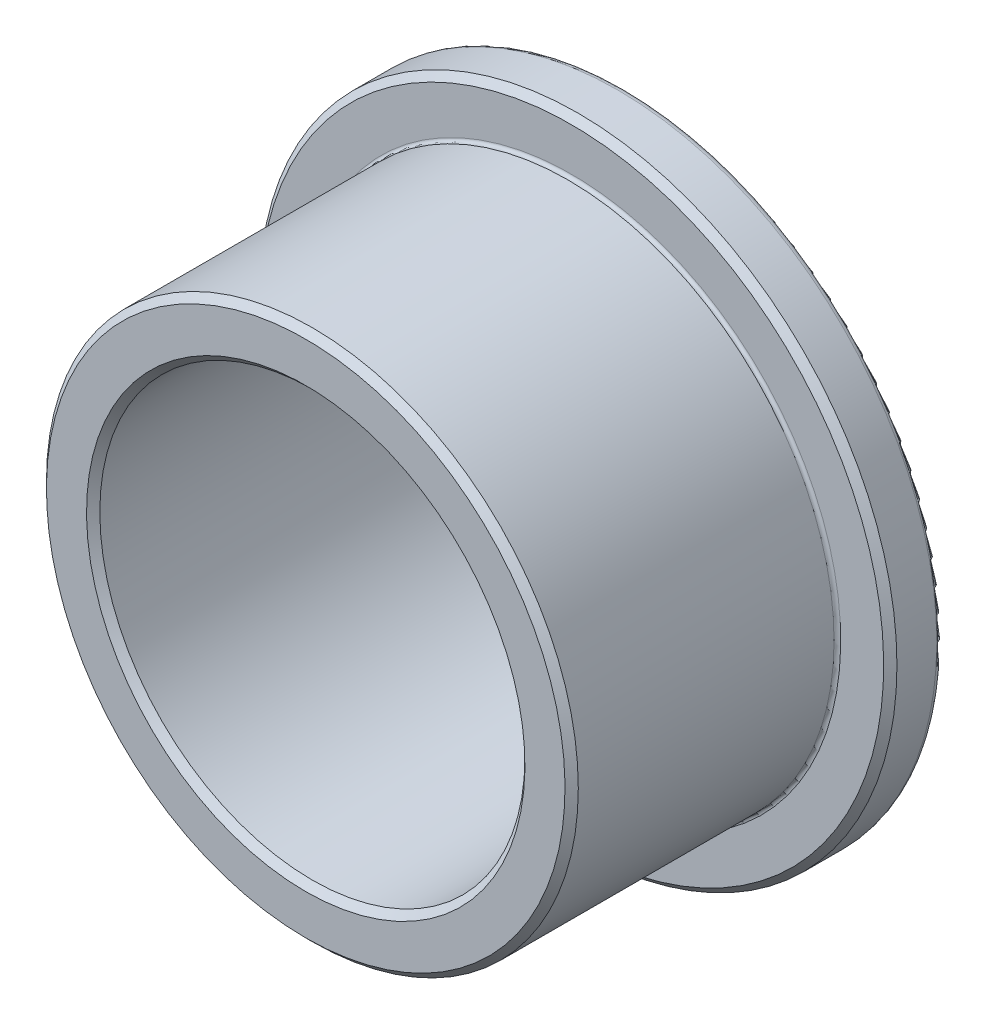
ISO-10303-21;
HEADER;
FILE_DESCRIPTION(('STEP AP214'),'2;1');
FILE_NAME('part.step','',(''),(''),'','','');
FILE_SCHEMA(('AUTOMOTIVE_DESIGN { 1 0 10303 214 1 1 1 1 }'));
ENDSEC;
DATA;
#1=APPLICATION_CONTEXT('core data for automotive mechanical design processes');
#2=APPLICATION_PROTOCOL_DEFINITION('international standard','automotive_design',2000,#1);
#3=PRODUCT_CONTEXT('',#1,'mechanical');
#4=PRODUCT('Part','Part','',(#3));
#5=PRODUCT_RELATED_PRODUCT_CATEGORY('part','',(#4));
#6=PRODUCT_DEFINITION_FORMATION('','',#4);
#7=PRODUCT_DEFINITION_CONTEXT('part definition',#1,'design');
#8=PRODUCT_DEFINITION('design','',#6,#7);
#9=PRODUCT_DEFINITION_SHAPE('','',#8);
#10=(LENGTH_UNIT() NAMED_UNIT(*) SI_UNIT(.MILLI.,.METRE.));
#11=(NAMED_UNIT(*) PLANE_ANGLE_UNIT() SI_UNIT($,.RADIAN.));
#12=(NAMED_UNIT(*) SI_UNIT($,.STERADIAN.) SOLID_ANGLE_UNIT());
#13=UNCERTAINTY_MEASURE_WITH_UNIT(LENGTH_MEASURE(1.E-05),#10,'distance_accuracy_value','');
#14=(GEOMETRIC_REPRESENTATION_CONTEXT(3) GLOBAL_UNCERTAINTY_ASSIGNED_CONTEXT((#13)) GLOBAL_UNIT_ASSIGNED_CONTEXT((#10,
#11,#12)) REPRESENTATION_CONTEXT('',''));
#15=CARTESIAN_POINT('',(0.,0.,0.));
#16=DIRECTION('',(0.,0.,1.));
#17=DIRECTION('',(1.,0.,0.));
#18=AXIS2_PLACEMENT_3D('',#15,#16,#17);
#19=CARTESIAN_POINT('',(0.,19.05,-9.525));
#20=DIRECTION('',(0.,0.,-1.));
#21=DIRECTION('',(0.,1.,0.));
#22=AXIS2_PLACEMENT_3D('',#19,#20,#21);
#23=PLANE('',#22);
#24=CARTESIAN_POINT('',(0.,0.,-9.525));
#25=DIRECTION('',(0.,0.,-1.));
#26=DIRECTION('',(0.,1.,0.));
#27=AXIS2_PLACEMENT_3D('',#24,#25,#26);
#28=CIRCLE('',#27,18.653125);
#29=CARTESIAN_POINT('',(0.,18.653125,-9.525));
#30=VERTEX_POINT('',#29);
#31=EDGE_CURVE('E59',#30,#30,#28,.T.);
#32=ORIENTED_EDGE('',*,*,#31,.T.);
#33=EDGE_LOOP('',(#32));
#34=FACE_BOUND('',#33,.T.);
#35=CARTESIAN_POINT('',(0.,0.,-9.525));
#36=DIRECTION('',(0.,0.,-1.));
#37=DIRECTION('',(0.,1.,0.));
#38=AXIS2_PLACEMENT_3D('',#35,#36,#37);
#39=CIRCLE('',#38,12.7);
#40=CARTESIAN_POINT('',(0.,12.7,-9.525));
#41=VERTEX_POINT('',#40);
#42=EDGE_CURVE('E89',#41,#41,#39,.T.);
#43=ORIENTED_EDGE('',*,*,#42,.F.);
#44=EDGE_LOOP('',(#43));
#45=FACE_BOUND('',#44,.T.);
#46=ADVANCED_FACE('F41',(#34,#45),#23,.T.);
#47=CARTESIAN_POINT('',(0.,0.,-9.525));
#48=DIRECTION('',(0.,0.,-1.));
#49=DIRECTION('',(0.,1.,0.));
#50=AXIS2_PLACEMENT_3D('',#47,#48,#49);
#51=CYLINDRICAL_SURFACE('',#50,19.05);
#52=CARTESIAN_POINT('',(0.,0.,-9.128125));
#53=DIRECTION('',(0.,0.,-1.));
#54=DIRECTION('',(0.,1.,0.));
#55=AXIS2_PLACEMENT_3D('',#52,#53,#54);
#56=CIRCLE('',#55,19.05);
#57=CARTESIAN_POINT('',(0.,19.05,-9.128125));
#58=VERTEX_POINT('',#57);
#59=EDGE_CURVE('E54',#58,#58,#56,.F.);
#60=ORIENTED_EDGE('',*,*,#59,.T.);
#61=EDGE_LOOP('',(#60));
#62=FACE_BOUND('',#61,.T.);
#63=CARTESIAN_POINT('',(0.,0.,-6.74687499999999));
#64=DIRECTION('',(0.,0.,1.));
#65=DIRECTION('',(0.,-1.,0.));
#66=AXIS2_PLACEMENT_3D('',#63,#64,#65);
#67=CIRCLE('',#66,19.05);
#68=CARTESIAN_POINT('',(0.,-19.05,-6.746875));
#69=VERTEX_POINT('',#68);
#70=EDGE_CURVE('E85',#69,#69,#67,.F.);
#71=ORIENTED_EDGE('',*,*,#70,.T.);
#72=EDGE_LOOP('',(#71));
#73=FACE_BOUND('',#72,.T.);
#74=ADVANCED_FACE('F97',(#62,#73),#51,.T.);
#75=CARTESIAN_POINT('',(0.,19.05,-6.35));
#76=DIRECTION('',(0.,0.,1.));
#77=DIRECTION('',(0.,-1.,0.));
#78=AXIS2_PLACEMENT_3D('',#75,#76,#77);
#79=PLANE('',#78);
#80=CARTESIAN_POINT('',(0.,0.,-6.35));
#81=DIRECTION('',(0.,0.,1.));
#82=DIRECTION('',(0.,-1.,0.));
#83=AXIS2_PLACEMENT_3D('',#80,#81,#82);
#84=CIRCLE('',#83,16.0861375);
#85=CARTESIAN_POINT('',(0.,-16.0861375,-6.35));
#86=VERTEX_POINT('',#85);
#87=EDGE_CURVE('E49',#86,#86,#84,.F.);
#88=ORIENTED_EDGE('',*,*,#87,.T.);
#89=EDGE_LOOP('',(#88));
#90=FACE_BOUND('',#89,.T.);
#91=CARTESIAN_POINT('',(0.,0.,-6.35));
#92=DIRECTION('',(0.,0.,1.));
#93=DIRECTION('',(0.,-1.,0.));
#94=AXIS2_PLACEMENT_3D('',#91,#92,#93);
#95=CIRCLE('',#94,18.653125);
#96=CARTESIAN_POINT('',(0.,-18.653125,-6.35));
#97=VERTEX_POINT('',#96);
#98=EDGE_CURVE('E81',#97,#97,#95,.T.);
#99=ORIENTED_EDGE('',*,*,#98,.T.);
#100=EDGE_LOOP('',(#99));
#101=FACE_BOUND('',#100,.T.);
#102=ADVANCED_FACE('F104',(#90,#101),#79,.T.);
#103=CARTESIAN_POINT('',(0.,0.,-9.525));
#104=DIRECTION('',(0.,0.,-1.));
#105=DIRECTION('',(0.,1.,0.));
#106=AXIS2_PLACEMENT_3D('',#103,#104,#105);
#107=CYLINDRICAL_SURFACE('',#106,15.8877);
#108=CARTESIAN_POINT('',(0.,0.,-6.1515625));
#109=DIRECTION('',(0.,0.,1.));
#110=DIRECTION('',(0.,-1.,0.));
#111=AXIS2_PLACEMENT_3D('',#108,#109,#110);
#112=CIRCLE('',#111,15.8877);
#113=CARTESIAN_POINT('',(0.,-15.8877,-6.1515625));
#114=VERTEX_POINT('',#113);
#115=EDGE_CURVE('E10',#114,#114,#112,.T.);
#116=ORIENTED_EDGE('',*,*,#115,.T.);
#117=EDGE_LOOP('',(#116));
#118=FACE_BOUND('',#117,.T.);
#119=CARTESIAN_POINT('',(0.,0.,9.128125));
#120=DIRECTION('',(0.,0.,1.));
#121=DIRECTION('',(0.,-1.,0.));
#122=AXIS2_PLACEMENT_3D('',#119,#120,#121);
#123=CIRCLE('',#122,15.8877);
#124=CARTESIAN_POINT('',(0.,-15.8877,9.128125));
#125=VERTEX_POINT('',#124);
#126=EDGE_CURVE('E77',#125,#125,#123,.F.);
#127=ORIENTED_EDGE('',*,*,#126,.T.);
#128=EDGE_LOOP('',(#127));
#129=FACE_BOUND('',#128,.T.);
#130=ADVANCED_FACE('F139',(#118,#129),#107,.T.);
#131=CARTESIAN_POINT('',(0.,15.8877,9.525));
#132=DIRECTION('',(0.,0.,1.));
#133=DIRECTION('',(0.,-1.,0.));
#134=AXIS2_PLACEMENT_3D('',#131,#132,#133);
#135=PLANE('',#134);
#136=CARTESIAN_POINT('',(0.,0.,9.525));
#137=DIRECTION('',(0.,0.,1.));
#138=DIRECTION('',(0.,-1.,0.));
#139=AXIS2_PLACEMENT_3D('',#136,#137,#138);
#140=CIRCLE('',#139,15.490825);
#141=CARTESIAN_POINT('',(0.,-15.490825,9.525));
#142=VERTEX_POINT('',#141);
#143=EDGE_CURVE('E69',#142,#142,#140,.T.);
#144=ORIENTED_EDGE('',*,*,#143,.T.);
#145=EDGE_LOOP('',(#144));
#146=FACE_BOUND('',#145,.T.);
#147=CARTESIAN_POINT('',(0.,0.,9.525));
#148=DIRECTION('',(0.,0.,1.));
#149=DIRECTION('',(0.,-1.,0.));
#150=AXIS2_PLACEMENT_3D('',#147,#148,#149);
#151=CIRCLE('',#150,13.096875);
#152=CARTESIAN_POINT('',(0.,-13.096875,9.525));
#153=VERTEX_POINT('',#152);
#154=EDGE_CURVE('E73',#153,#153,#151,.F.);
#155=ORIENTED_EDGE('',*,*,#154,.T.);
#156=EDGE_LOOP('',(#155));
#157=FACE_BOUND('',#156,.T.);
#158=ADVANCED_FACE('F142',(#146,#157),#135,.T.);
#159=CARTESIAN_POINT('',(0.,0.,-9.525));
#160=DIRECTION('',(0.,0.,-1.));
#161=DIRECTION('',(0.,1.,0.));
#162=AXIS2_PLACEMENT_3D('',#159,#160,#161);
#163=CYLINDRICAL_SURFACE('',#162,12.7);
#164=CARTESIAN_POINT('',(0.,0.,9.128125));
#165=DIRECTION('',(0.,0.,1.));
#166=DIRECTION('',(0.,-1.,0.));
#167=AXIS2_PLACEMENT_3D('',#164,#165,#166);
#168=CIRCLE('',#167,12.7);
#169=CARTESIAN_POINT('',(0.,-12.7,9.128125));
#170=VERTEX_POINT('',#169);
#171=EDGE_CURVE('E65',#170,#170,#168,.T.);
#172=ORIENTED_EDGE('',*,*,#171,.T.);
#173=EDGE_LOOP('',(#172));
#174=FACE_BOUND('',#173,.T.);
#175=ORIENTED_EDGE('',*,*,#42,.T.);
#176=EDGE_LOOP('',(#175));
#177=FACE_BOUND('',#176,.T.);
#178=ADVANCED_FACE('F94',(#174,#177),#163,.F.);
#179=CARTESIAN_POINT('',(0.,0.,-6.74687499999999));
#180=DIRECTION('',(0.,0.,-1.));
#181=DIRECTION('',(0.,1.,0.));
#182=AXIS2_PLACEMENT_3D('',#179,#180,#181);
#183=CONICAL_SURFACE('',#182,19.05,0.785398163397448);
#184=ORIENTED_EDGE('',*,*,#98,.F.);
#185=EDGE_LOOP('',(#184));
#186=FACE_BOUND('',#185,.T.);
#187=ORIENTED_EDGE('',*,*,#70,.F.);
#188=EDGE_LOOP('',(#187));
#189=FACE_BOUND('',#188,.T.);
#190=ADVANCED_FACE('F109',(#186,#189),#183,.T.);
#191=CARTESIAN_POINT('',(0.,0.,9.128125));
#192=DIRECTION('',(0.,0.,-1.));
#193=DIRECTION('',(0.,1.,0.));
#194=AXIS2_PLACEMENT_3D('',#191,#192,#193);
#195=CONICAL_SURFACE('',#194,15.8877,0.785398163397448);
#196=ORIENTED_EDGE('',*,*,#143,.F.);
#197=EDGE_LOOP('',(#196));
#198=FACE_BOUND('',#197,.T.);
#199=ORIENTED_EDGE('',*,*,#126,.F.);
#200=EDGE_LOOP('',(#199));
#201=FACE_BOUND('',#200,.T.);
#202=ADVANCED_FACE('F112',(#198,#201),#195,.T.);
#203=CARTESIAN_POINT('',(0.,0.,9.525));
#204=DIRECTION('',(0.,0.,1.));
#205=DIRECTION('',(0.,-1.,0.));
#206=AXIS2_PLACEMENT_3D('',#203,#204,#205);
#207=CONICAL_SURFACE('',#206,13.096875,0.78539816339745);
#208=ORIENTED_EDGE('',*,*,#171,.F.);
#209=EDGE_LOOP('',(#208));
#210=FACE_BOUND('',#209,.T.);
#211=ORIENTED_EDGE('',*,*,#154,.F.);
#212=EDGE_LOOP('',(#211));
#213=FACE_BOUND('',#212,.T.);
#214=ADVANCED_FACE('F116',(#210,#213),#207,.F.);
#215=CARTESIAN_POINT('',(0.,0.,-9.128125));
#216=DIRECTION('',(0.,0.,-1.));
#217=DIRECTION('',(0.,1.,0.));
#218=AXIS2_PLACEMENT_3D('',#215,#216,#217);
#219=TOROIDAL_SURFACE('',#218,18.653125,0.396875);
#220=ORIENTED_EDGE('',*,*,#59,.F.);
#221=EDGE_LOOP('',(#220));
#222=FACE_BOUND('',#221,.T.);
#223=ORIENTED_EDGE('',*,*,#31,.F.);
#224=EDGE_LOOP('',(#223));
#225=FACE_BOUND('',#224,.T.);
#226=ADVANCED_FACE('F118',(#222,#225),#219,.T.);
#227=CARTESIAN_POINT('',(0.,0.,-6.1515625));
#228=DIRECTION('',(0.,0.,1.));
#229=DIRECTION('',(0.,-1.,0.));
#230=AXIS2_PLACEMENT_3D('',#227,#228,#229);
#231=TOROIDAL_SURFACE('',#230,16.0861375,0.1984375);
#232=ORIENTED_EDGE('',*,*,#115,.F.);
#233=EDGE_LOOP('',(#232));
#234=FACE_BOUND('',#233,.T.);
#235=ORIENTED_EDGE('',*,*,#87,.F.);
#236=EDGE_LOOP('',(#235));
#237=FACE_BOUND('',#236,.T.);
#238=ADVANCED_FACE('F43',(#234,#237),#231,.F.);
#239=CLOSED_SHELL('',(#46,#74,#102,#130,#158,#178,#190,#202,#214,#226,#238));
#240=MANIFOLD_SOLID_BREP('B2',#239);
#241=ADVANCED_BREP_SHAPE_REPRESENTATION('',(#18,#240),#14);
#242=SHAPE_DEFINITION_REPRESENTATION(#9,#241);
ENDSEC;
END-ISO-10303-21;
